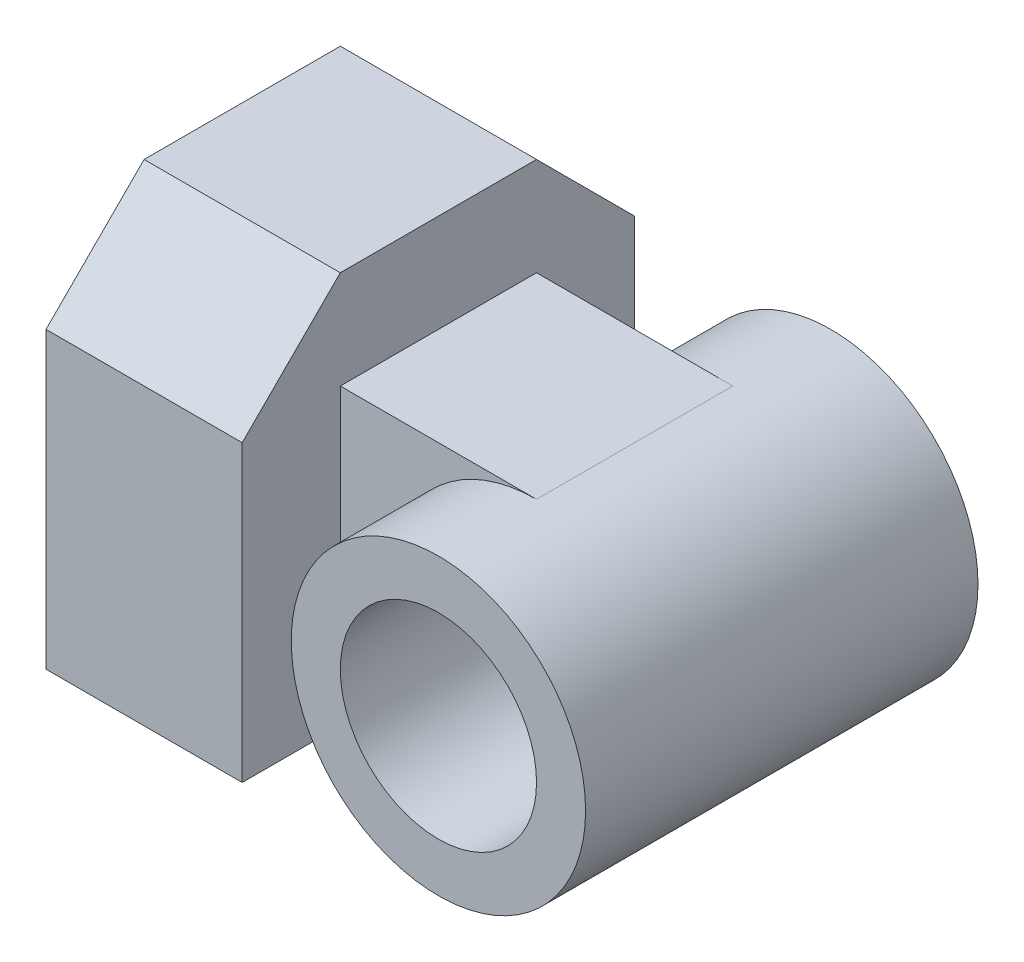
ISO-10303-21;
HEADER;
FILE_DESCRIPTION(('STEP AP214'),'2;1');
FILE_NAME('part.step','',(''),(''),'','','');
FILE_SCHEMA(('AUTOMOTIVE_DESIGN { 1 0 10303 214 1 1 1 1 }'));
ENDSEC;
DATA;
#1=APPLICATION_CONTEXT('core data for automotive mechanical design processes');
#2=APPLICATION_PROTOCOL_DEFINITION('international standard','automotive_design',2000,#1);
#3=PRODUCT_CONTEXT('',#1,'mechanical');
#4=PRODUCT('Part','Part','',(#3));
#5=PRODUCT_RELATED_PRODUCT_CATEGORY('part','',(#4));
#6=PRODUCT_DEFINITION_FORMATION('','',#4);
#7=PRODUCT_DEFINITION_CONTEXT('part definition',#1,'design');
#8=PRODUCT_DEFINITION('design','',#6,#7);
#9=PRODUCT_DEFINITION_SHAPE('','',#8);
#10=(LENGTH_UNIT() NAMED_UNIT(*) SI_UNIT(.MILLI.,.METRE.));
#11=(NAMED_UNIT(*) PLANE_ANGLE_UNIT() SI_UNIT($,.RADIAN.));
#12=(NAMED_UNIT(*) SI_UNIT($,.STERADIAN.) SOLID_ANGLE_UNIT());
#13=UNCERTAINTY_MEASURE_WITH_UNIT(LENGTH_MEASURE(1.E-05),#10,'distance_accuracy_value','');
#14=(GEOMETRIC_REPRESENTATION_CONTEXT(3) GLOBAL_UNCERTAINTY_ASSIGNED_CONTEXT((#13)) GLOBAL_UNIT_ASSIGNED_CONTEXT((#10,
#11,#12)) REPRESENTATION_CONTEXT('',''));
#15=CARTESIAN_POINT('',(0.,0.,0.));
#16=DIRECTION('',(0.,0.,1.));
#17=DIRECTION('',(1.,0.,0.));
#18=AXIS2_PLACEMENT_3D('',#15,#16,#17);
#19=CARTESIAN_POINT('',(25.4,-50.8,50.8));
#20=DIRECTION('',(-1.,0.,0.));
#21=DIRECTION('',(0.,0.,1.));
#22=AXIS2_PLACEMENT_3D('',#19,#20,#21);
#23=PLANE('',#22);
#24=DIRECTION('',(0.,1.,0.));
#25=VECTOR('',#24,1.);
#26=CARTESIAN_POINT('',(25.4,-50.8,-50.8));
#27=LINE('',#26,#25);
#28=CARTESIAN_POINT('',(25.4,-50.8,-50.8));
#29=VERTEX_POINT('',#28);
#30=CARTESIAN_POINT('',(25.4,25.3999999999999,-50.8));
#31=VERTEX_POINT('',#30);
#32=EDGE_CURVE('E154',#29,#31,#27,.T.);
#33=ORIENTED_EDGE('',*,*,#32,.T.);
#34=DIRECTION('',(0.,0.707106781186548,0.707106781186548));
#35=VECTOR('',#34,1.);
#36=CARTESIAN_POINT('',(25.4,50.8,-25.3999999999999));
#37=LINE('',#36,#35);
#38=CARTESIAN_POINT('',(25.4,50.8,-25.3999999999999));
#39=VERTEX_POINT('',#38);
#40=EDGE_CURVE('E56',#31,#39,#37,.T.);
#41=ORIENTED_EDGE('',*,*,#40,.T.);
#42=DIRECTION('',(0.,0.,-1.));
#43=VECTOR('',#42,1.);
#44=CARTESIAN_POINT('',(25.4,50.8,50.8));
#45=LINE('',#44,#43);
#46=CARTESIAN_POINT('',(25.4,50.8,25.3999999999999));
#47=VERTEX_POINT('',#46);
#48=EDGE_CURVE('E161',#47,#39,#45,.T.);
#49=ORIENTED_EDGE('',*,*,#48,.F.);
#50=DIRECTION('',(0.,0.707106781186548,-0.707106781186548));
#51=VECTOR('',#50,1.);
#52=CARTESIAN_POINT('',(25.4,25.3999999999999,50.8));
#53=LINE('',#52,#51);
#54=CARTESIAN_POINT('',(25.4,25.3999999999999,50.8));
#55=VERTEX_POINT('',#54);
#56=EDGE_CURVE('E63',#47,#55,#53,.F.);
#57=ORIENTED_EDGE('',*,*,#56,.T.);
#58=DIRECTION('',(0.,1.,0.));
#59=VECTOR('',#58,1.);
#60=CARTESIAN_POINT('',(25.4,-50.8,50.8));
#61=LINE('',#60,#59);
#62=CARTESIAN_POINT('',(25.4,-50.8,50.8));
#63=VERTEX_POINT('',#62);
#64=EDGE_CURVE('E209',#63,#55,#61,.T.);
#65=ORIENTED_EDGE('',*,*,#64,.F.);
#66=DIRECTION('',(0.,0.,-1.));
#67=VECTOR('',#66,1.);
#68=CARTESIAN_POINT('',(25.4,-50.8,50.8));
#69=LINE('',#68,#67);
#70=CARTESIAN_POINT('',(25.4,-50.8,25.4));
#71=VERTEX_POINT('',#70);
#72=EDGE_CURVE('E214',#63,#71,#69,.T.);
#73=ORIENTED_EDGE('',*,*,#72,.T.);
#74=DIRECTION('',(0.,-1.,0.));
#75=VECTOR('',#74,1.);
#76=CARTESIAN_POINT('',(25.4,-50.8,25.4));
#77=LINE('',#76,#75);
#78=CARTESIAN_POINT('',(25.4,25.4,25.4));
#79=VERTEX_POINT('',#78);
#80=EDGE_CURVE('E152',#79,#71,#77,.T.);
#81=ORIENTED_EDGE('',*,*,#80,.F.);
#82=DIRECTION('',(0.,0.,1.));
#83=VECTOR('',#82,1.);
#84=CARTESIAN_POINT('',(25.4,25.4,25.4));
#85=LINE('',#84,#83);
#86=CARTESIAN_POINT('',(25.4,25.4,-25.4));
#87=VERTEX_POINT('',#86);
#88=EDGE_CURVE('E247',#87,#79,#85,.T.);
#89=ORIENTED_EDGE('',*,*,#88,.F.);
#90=DIRECTION('',(0.,1.,0.));
#91=VECTOR('',#90,1.);
#92=CARTESIAN_POINT('',(25.4,-50.8,-25.4));
#93=LINE('',#92,#91);
#94=CARTESIAN_POINT('',(25.4,-50.8,-25.4));
#95=VERTEX_POINT('',#94);
#96=EDGE_CURVE('E243',#95,#87,#93,.T.);
#97=ORIENTED_EDGE('',*,*,#96,.F.);
#98=EDGE_CURVE('E218',#95,#29,#69,.T.);
#99=ORIENTED_EDGE('',*,*,#98,.T.);
#100=EDGE_LOOP('',(#33,#41,#49,#57,#65,#73,#81,#89,#97,#99));
#101=FACE_BOUND('',#100,.T.);
#102=ADVANCED_FACE('F46',(#101),#23,.F.);
#103=CARTESIAN_POINT('',(-25.4,50.8,50.8));
#104=DIRECTION('',(0.,-1.,0.));
#105=DIRECTION('',(0.,0.,-1.));
#106=AXIS2_PLACEMENT_3D('',#103,#104,#105);
#107=PLANE('',#106);
#108=ORIENTED_EDGE('',*,*,#48,.T.);
#109=DIRECTION('',(-1.,0.,0.));
#110=VECTOR('',#109,1.);
#111=CARTESIAN_POINT('',(-25.4,50.8,-25.3999999999999));
#112=LINE('',#111,#110);
#113=CARTESIAN_POINT('',(-25.4,50.8,-25.3999999999999));
#114=VERTEX_POINT('',#113);
#115=EDGE_CURVE('E166',#39,#114,#112,.T.);
#116=ORIENTED_EDGE('',*,*,#115,.T.);
#117=DIRECTION('',(0.,0.,-1.));
#118=VECTOR('',#117,1.);
#119=CARTESIAN_POINT('',(-25.4,50.8,50.8));
#120=LINE('',#119,#118);
#121=CARTESIAN_POINT('',(-25.4,50.8,25.3999999999999));
#122=VERTEX_POINT('',#121);
#123=EDGE_CURVE('E169',#122,#114,#120,.T.);
#124=ORIENTED_EDGE('',*,*,#123,.F.);
#125=DIRECTION('',(1.,0.,0.));
#126=VECTOR('',#125,1.);
#127=CARTESIAN_POINT('',(-25.4,50.8,25.3999999999999));
#128=LINE('',#127,#126);
#129=EDGE_CURVE('E160',#122,#47,#128,.T.);
#130=ORIENTED_EDGE('',*,*,#129,.T.);
#131=EDGE_LOOP('',(#108,#116,#124,#130));
#132=FACE_BOUND('',#131,.T.);
#133=ADVANCED_FACE('F191',(#132),#107,.F.);
#134=CARTESIAN_POINT('',(-25.4,-50.8,50.8));
#135=DIRECTION('',(1.,0.,0.));
#136=DIRECTION('',(0.,0.,-1.));
#137=AXIS2_PLACEMENT_3D('',#134,#135,#136);
#138=PLANE('',#137);
#139=ORIENTED_EDGE('',*,*,#123,.T.);
#140=DIRECTION('',(0.,-0.707106781186548,-0.707106781186548));
#141=VECTOR('',#140,1.);
#142=CARTESIAN_POINT('',(-25.4,50.8,-25.3999999999999));
#143=LINE('',#142,#141);
#144=CARTESIAN_POINT('',(-25.4,25.3999999999999,-50.8));
#145=VERTEX_POINT('',#144);
#146=EDGE_CURVE('E179',#114,#145,#143,.T.);
#147=ORIENTED_EDGE('',*,*,#146,.T.);
#148=DIRECTION('',(0.,-1.,0.));
#149=VECTOR('',#148,1.);
#150=CARTESIAN_POINT('',(-25.4,-50.8,-50.8));
#151=LINE('',#150,#149);
#152=CARTESIAN_POINT('',(-25.4,-50.8,-50.8));
#153=VERTEX_POINT('',#152);
#154=EDGE_CURVE('E199',#145,#153,#151,.T.);
#155=ORIENTED_EDGE('',*,*,#154,.T.);
#156=DIRECTION('',(0.,0.,-1.));
#157=VECTOR('',#156,1.);
#158=CARTESIAN_POINT('',(-25.4,-50.8,50.8));
#159=LINE('',#158,#157);
#160=CARTESIAN_POINT('',(-25.4,-50.8,50.8));
#161=VERTEX_POINT('',#160);
#162=EDGE_CURVE('E217',#161,#153,#159,.T.);
#163=ORIENTED_EDGE('',*,*,#162,.F.);
#164=DIRECTION('',(0.,-1.,0.));
#165=VECTOR('',#164,1.);
#166=CARTESIAN_POINT('',(-25.4,-50.8,50.8));
#167=LINE('',#166,#165);
#168=CARTESIAN_POINT('',(-25.4,25.3999999999999,50.8));
#169=VERTEX_POINT('',#168);
#170=EDGE_CURVE('E231',#169,#161,#167,.T.);
#171=ORIENTED_EDGE('',*,*,#170,.F.);
#172=DIRECTION('',(0.,-0.707106781186548,0.707106781186548));
#173=VECTOR('',#172,1.);
#174=CARTESIAN_POINT('',(-25.4,25.3999999999999,50.8));
#175=LINE('',#174,#173);
#176=EDGE_CURVE('E176',#169,#122,#175,.F.);
#177=ORIENTED_EDGE('',*,*,#176,.T.);
#178=EDGE_LOOP('',(#139,#147,#155,#163,#171,#177));
#179=FACE_BOUND('',#178,.T.);
#180=ADVANCED_FACE('F197',(#179),#138,.F.);
#181=CARTESIAN_POINT('',(-25.4,-50.8,50.8));
#182=DIRECTION('',(0.,1.,0.));
#183=DIRECTION('',(0.,0.,1.));
#184=AXIS2_PLACEMENT_3D('',#181,#182,#183);
#185=PLANE('',#184);
#186=DIRECTION('',(1.,0.,0.));
#187=VECTOR('',#186,1.);
#188=CARTESIAN_POINT('',(-25.4,-50.8,-50.8));
#189=LINE('',#188,#187);
#190=EDGE_CURVE('E203',#153,#29,#189,.T.);
#191=ORIENTED_EDGE('',*,*,#190,.T.);
#192=ORIENTED_EDGE('',*,*,#98,.F.);
#193=DIRECTION('',(1.,0.,0.));
#194=VECTOR('',#193,1.);
#195=CARTESIAN_POINT('',(-66.1810023967853,-50.8,-25.4));
#196=LINE('',#195,#194);
#197=CARTESIAN_POINT('',(76.2,-50.8,-25.4));
#198=VERTEX_POINT('',#197);
#199=EDGE_CURVE('E138',#95,#198,#196,.T.);
#200=ORIENTED_EDGE('',*,*,#199,.T.);
#201=DIRECTION('',(0.,0.,-1.));
#202=VECTOR('',#201,1.);
#203=CARTESIAN_POINT('',(76.2,-50.8,25.4));
#204=LINE('',#203,#202);
#205=CARTESIAN_POINT('',(76.2,-50.8,25.4));
#206=VERTEX_POINT('',#205);
#207=EDGE_CURVE('E130',#206,#198,#204,.T.);
#208=ORIENTED_EDGE('',*,*,#207,.F.);
#209=DIRECTION('',(1.,0.,0.));
#210=VECTOR('',#209,1.);
#211=CARTESIAN_POINT('',(-66.1810023967853,-50.8,25.4));
#212=LINE('',#211,#210);
#213=EDGE_CURVE('E135',#71,#206,#212,.T.);
#214=ORIENTED_EDGE('',*,*,#213,.F.);
#215=ORIENTED_EDGE('',*,*,#72,.F.);
#216=DIRECTION('',(1.,0.,0.));
#217=VECTOR('',#216,1.);
#218=CARTESIAN_POINT('',(-25.4,-50.8,50.8));
#219=LINE('',#218,#217);
#220=EDGE_CURVE('E228',#161,#63,#219,.T.);
#221=ORIENTED_EDGE('',*,*,#220,.F.);
#222=ORIENTED_EDGE('',*,*,#162,.T.);
#223=EDGE_LOOP('',(#191,#192,#200,#208,#214,#215,#221,#222));
#224=FACE_BOUND('',#223,.T.);
#225=ADVANCED_FACE('F133',(#224),#185,.F.);
#226=CARTESIAN_POINT('',(0.,0.,50.8));
#227=DIRECTION('',(0.,0.,-1.));
#228=DIRECTION('',(-1.,0.,0.));
#229=AXIS2_PLACEMENT_3D('',#226,#227,#228);
#230=PLANE('',#229);
#231=ORIENTED_EDGE('',*,*,#64,.T.);
#232=DIRECTION('',(-1.,0.,0.));
#233=VECTOR('',#232,1.);
#234=CARTESIAN_POINT('',(0.,25.3999999999999,50.8));
#235=LINE('',#234,#233);
#236=EDGE_CURVE('E11',#55,#169,#235,.T.);
#237=ORIENTED_EDGE('',*,*,#236,.T.);
#238=ORIENTED_EDGE('',*,*,#170,.T.);
#239=ORIENTED_EDGE('',*,*,#220,.T.);
#240=EDGE_LOOP('',(#231,#237,#238,#239));
#241=FACE_BOUND('',#240,.T.);
#242=ADVANCED_FACE('F323',(#241),#230,.F.);
#243=CARTESIAN_POINT('',(0.,0.,-50.8));
#244=DIRECTION('',(0.,0.,-1.));
#245=DIRECTION('',(-1.,0.,0.));
#246=AXIS2_PLACEMENT_3D('',#243,#244,#245);
#247=PLANE('',#246);
#248=ORIENTED_EDGE('',*,*,#154,.F.);
#249=DIRECTION('',(1.,0.,0.));
#250=VECTOR('',#249,1.);
#251=CARTESIAN_POINT('',(25.4,25.3999999999999,-50.8));
#252=LINE('',#251,#250);
#253=EDGE_CURVE('E71',#145,#31,#252,.T.);
#254=ORIENTED_EDGE('',*,*,#253,.T.);
#255=ORIENTED_EDGE('',*,*,#32,.F.);
#256=ORIENTED_EDGE('',*,*,#190,.F.);
#257=EDGE_LOOP('',(#248,#254,#255,#256));
#258=FACE_BOUND('',#257,.T.);
#259=ADVANCED_FACE('F202',(#258),#247,.T.);
#260=CARTESIAN_POINT('',(-66.1810023967853,-50.8,-25.4));
#261=DIRECTION('',(0.,0.,-1.));
#262=DIRECTION('',(-1.,0.,0.));
#263=AXIS2_PLACEMENT_3D('',#260,#261,#262);
#264=PLANE('',#263);
#265=CARTESIAN_POINT('',(76.2,-12.7,-25.4));
#266=DIRECTION('',(0.,0.,-1.));
#267=DIRECTION('',(-1.,0.,0.));
#268=AXIS2_PLACEMENT_3D('',#265,#266,#267);
#269=CIRCLE('',#268,38.1);
#270=CARTESIAN_POINT('',(76.2,25.4,-25.4));
#271=VERTEX_POINT('',#270);
#272=EDGE_CURVE('E144',#198,#271,#269,.T.);
#273=ORIENTED_EDGE('',*,*,#272,.F.);
#274=ORIENTED_EDGE('',*,*,#199,.F.);
#275=ORIENTED_EDGE('',*,*,#96,.T.);
#276=DIRECTION('',(1.,0.,0.));
#277=VECTOR('',#276,1.);
#278=CARTESIAN_POINT('',(-66.1810023967853,25.4,-25.4));
#279=LINE('',#278,#277);
#280=EDGE_CURVE('E244',#87,#271,#279,.T.);
#281=ORIENTED_EDGE('',*,*,#280,.T.);
#282=EDGE_LOOP('',(#273,#274,#275,#281));
#283=FACE_BOUND('',#282,.T.);
#284=ADVANCED_FACE('F328',(#283),#264,.T.);
#285=CARTESIAN_POINT('',(-66.1810023967853,25.4,25.4));
#286=DIRECTION('',(0.,1.,0.));
#287=DIRECTION('',(0.,0.,1.));
#288=AXIS2_PLACEMENT_3D('',#285,#286,#287);
#289=PLANE('',#288);
#290=ORIENTED_EDGE('',*,*,#280,.F.);
#291=ORIENTED_EDGE('',*,*,#88,.T.);
#292=DIRECTION('',(1.,0.,0.));
#293=VECTOR('',#292,1.);
#294=CARTESIAN_POINT('',(-66.1810023967853,25.4,25.4));
#295=LINE('',#294,#293);
#296=CARTESIAN_POINT('',(76.2,25.4,25.4));
#297=VERTEX_POINT('',#296);
#298=EDGE_CURVE('E248',#79,#297,#295,.T.);
#299=ORIENTED_EDGE('',*,*,#298,.T.);
#300=DIRECTION('',(0.,0.,1.));
#301=VECTOR('',#300,1.);
#302=CARTESIAN_POINT('',(76.2,25.4,25.4));
#303=LINE('',#302,#301);
#304=EDGE_CURVE('E143',#271,#297,#303,.T.);
#305=ORIENTED_EDGE('',*,*,#304,.F.);
#306=EDGE_LOOP('',(#290,#291,#299,#305));
#307=FACE_BOUND('',#306,.T.);
#308=ADVANCED_FACE('F300',(#307),#289,.T.);
#309=CARTESIAN_POINT('',(-66.1810023967853,-50.8,25.4));
#310=DIRECTION('',(0.,0.,1.));
#311=DIRECTION('',(1.,0.,0.));
#312=AXIS2_PLACEMENT_3D('',#309,#310,#311);
#313=PLANE('',#312);
#314=CARTESIAN_POINT('',(76.2,-12.7,25.4));
#315=DIRECTION('',(0.,0.,1.));
#316=DIRECTION('',(1.,0.,0.));
#317=AXIS2_PLACEMENT_3D('',#314,#315,#316);
#318=CIRCLE('',#317,38.1);
#319=EDGE_CURVE('E150',#297,#206,#318,.T.);
#320=ORIENTED_EDGE('',*,*,#319,.F.);
#321=ORIENTED_EDGE('',*,*,#298,.F.);
#322=ORIENTED_EDGE('',*,*,#80,.T.);
#323=ORIENTED_EDGE('',*,*,#213,.T.);
#324=EDGE_LOOP('',(#320,#321,#322,#323));
#325=FACE_BOUND('',#324,.T.);
#326=ADVANCED_FACE('F148',(#325),#313,.T.);
#327=CARTESIAN_POINT('',(76.2,-12.7,-158.56307345283));
#328=DIRECTION('',(0.,0.,1.));
#329=DIRECTION('',(1.,0.,0.));
#330=AXIS2_PLACEMENT_3D('',#327,#328,#329);
#331=CYLINDRICAL_SURFACE('',#330,38.1);
#332=CARTESIAN_POINT('',(76.2,-12.7,-50.8));
#333=DIRECTION('',(0.,0.,-1.));
#334=DIRECTION('',(-1.,0.,0.));
#335=AXIS2_PLACEMENT_3D('',#332,#333,#334);
#336=CIRCLE('',#335,38.1);
#337=CARTESIAN_POINT('',(38.1,-12.7,-50.8));
#338=VERTEX_POINT('',#337);
#339=EDGE_CURVE('E263',#338,#338,#336,.F.);
#340=ORIENTED_EDGE('',*,*,#339,.T.);
#341=EDGE_LOOP('',(#340));
#342=FACE_BOUND('',#341,.T.);
#343=CARTESIAN_POINT('',(76.2,-12.7,50.8));
#344=DIRECTION('',(0.,0.,1.));
#345=DIRECTION('',(1.,0.,0.));
#346=AXIS2_PLACEMENT_3D('',#343,#344,#345);
#347=CIRCLE('',#346,38.1);
#348=CARTESIAN_POINT('',(114.3,-12.7,50.8));
#349=VERTEX_POINT('',#348);
#350=EDGE_CURVE('E267',#349,#349,#347,.T.);
#351=ORIENTED_EDGE('',*,*,#350,.F.);
#352=EDGE_LOOP('',(#351));
#353=FACE_BOUND('',#352,.T.);
#354=ORIENTED_EDGE('',*,*,#207,.T.);
#355=ORIENTED_EDGE('',*,*,#272,.T.);
#356=ORIENTED_EDGE('',*,*,#304,.T.);
#357=ORIENTED_EDGE('',*,*,#319,.T.);
#358=EDGE_LOOP('',(#354,#355,#356,#357));
#359=FACE_BOUND('',#358,.T.);
#360=ADVANCED_FACE('F157',(#342,#353,#359),#331,.T.);
#361=CARTESIAN_POINT('',(0.,0.,-50.8));
#362=DIRECTION('',(0.,0.,-1.));
#363=DIRECTION('',(-1.,0.,0.));
#364=AXIS2_PLACEMENT_3D('',#361,#362,#363);
#365=PLANE('',#364);
#366=CARTESIAN_POINT('',(76.2,-12.7,-50.8));
#367=DIRECTION('',(0.,0.,1.));
#368=DIRECTION('',(1.,0.,0.));
#369=AXIS2_PLACEMENT_3D('',#366,#367,#368);
#370=CIRCLE('',#369,25.4);
#371=CARTESIAN_POINT('',(101.6,-12.7,-50.8));
#372=VERTEX_POINT('',#371);
#373=EDGE_CURVE('E271',#372,#372,#370,.T.);
#374=ORIENTED_EDGE('',*,*,#373,.T.);
#375=EDGE_LOOP('',(#374));
#376=FACE_BOUND('',#375,.T.);
#377=ORIENTED_EDGE('',*,*,#339,.F.);
#378=EDGE_LOOP('',(#377));
#379=FACE_BOUND('',#378,.T.);
#380=ADVANCED_FACE('F286',(#376,#379),#365,.T.);
#381=CARTESIAN_POINT('',(76.2,-12.7,50.8));
#382=DIRECTION('',(0.,0.,1.));
#383=DIRECTION('',(1.,0.,0.));
#384=AXIS2_PLACEMENT_3D('',#381,#382,#383);
#385=PLANE('',#384);
#386=CARTESIAN_POINT('',(76.2,-12.7,50.8));
#387=DIRECTION('',(0.,0.,1.));
#388=DIRECTION('',(1.,0.,0.));
#389=AXIS2_PLACEMENT_3D('',#386,#387,#388);
#390=CIRCLE('',#389,25.4);
#391=CARTESIAN_POINT('',(101.6,-12.7,50.8));
#392=VERTEX_POINT('',#391);
#393=EDGE_CURVE('E275',#392,#392,#390,.T.);
#394=ORIENTED_EDGE('',*,*,#393,.F.);
#395=EDGE_LOOP('',(#394));
#396=FACE_BOUND('',#395,.T.);
#397=ORIENTED_EDGE('',*,*,#350,.T.);
#398=EDGE_LOOP('',(#397));
#399=FACE_BOUND('',#398,.T.);
#400=ADVANCED_FACE('F283',(#396,#399),#385,.T.);
#401=CARTESIAN_POINT('',(-25.4,50.8,-25.3999999999999));
#402=DIRECTION('',(0.,0.707106781186548,-0.707106781186548));
#403=DIRECTION('',(1.,0.,0.));
#404=AXIS2_PLACEMENT_3D('',#401,#402,#403);
#405=PLANE('',#404);
#406=ORIENTED_EDGE('',*,*,#40,.F.);
#407=ORIENTED_EDGE('',*,*,#253,.F.);
#408=ORIENTED_EDGE('',*,*,#146,.F.);
#409=ORIENTED_EDGE('',*,*,#115,.F.);
#410=EDGE_LOOP('',(#406,#407,#408,#409));
#411=FACE_BOUND('',#410,.T.);
#412=ADVANCED_FACE('F195',(#411),#405,.T.);
#413=CARTESIAN_POINT('',(0.,25.3999999999999,50.8));
#414=DIRECTION('',(0.,-0.707106781186548,-0.707106781186548));
#415=DIRECTION('',(-1.,0.,0.));
#416=AXIS2_PLACEMENT_3D('',#413,#414,#415);
#417=PLANE('',#416);
#418=ORIENTED_EDGE('',*,*,#56,.F.);
#419=ORIENTED_EDGE('',*,*,#129,.F.);
#420=ORIENTED_EDGE('',*,*,#176,.F.);
#421=ORIENTED_EDGE('',*,*,#236,.F.);
#422=EDGE_LOOP('',(#418,#419,#420,#421));
#423=FACE_BOUND('',#422,.T.);
#424=ADVANCED_FACE('F49',(#423),#417,.F.);
#425=CARTESIAN_POINT('',(76.2,-12.7,50.8));
#426=DIRECTION('',(0.,0.,1.));
#427=DIRECTION('',(1.,0.,0.));
#428=AXIS2_PLACEMENT_3D('',#425,#426,#427);
#429=CYLINDRICAL_SURFACE('',#428,25.4);
#430=ORIENTED_EDGE('',*,*,#373,.F.);
#431=EDGE_LOOP('',(#430));
#432=FACE_BOUND('',#431,.T.);
#433=ORIENTED_EDGE('',*,*,#393,.T.);
#434=EDGE_LOOP('',(#433));
#435=FACE_BOUND('',#434,.T.);
#436=ADVANCED_FACE('F281',(#432,#435),#429,.F.);
#437=CLOSED_SHELL('',(#102,#133,#180,#225,#242,#259,#284,#308,#326,#360,#380,#400,#412,#424,#436));
#438=MANIFOLD_SOLID_BREP('B2',#437);
#439=ADVANCED_BREP_SHAPE_REPRESENTATION('',(#18,#438),#14);
#440=SHAPE_DEFINITION_REPRESENTATION(#9,#439);
ENDSEC;
END-ISO-10303-21;
